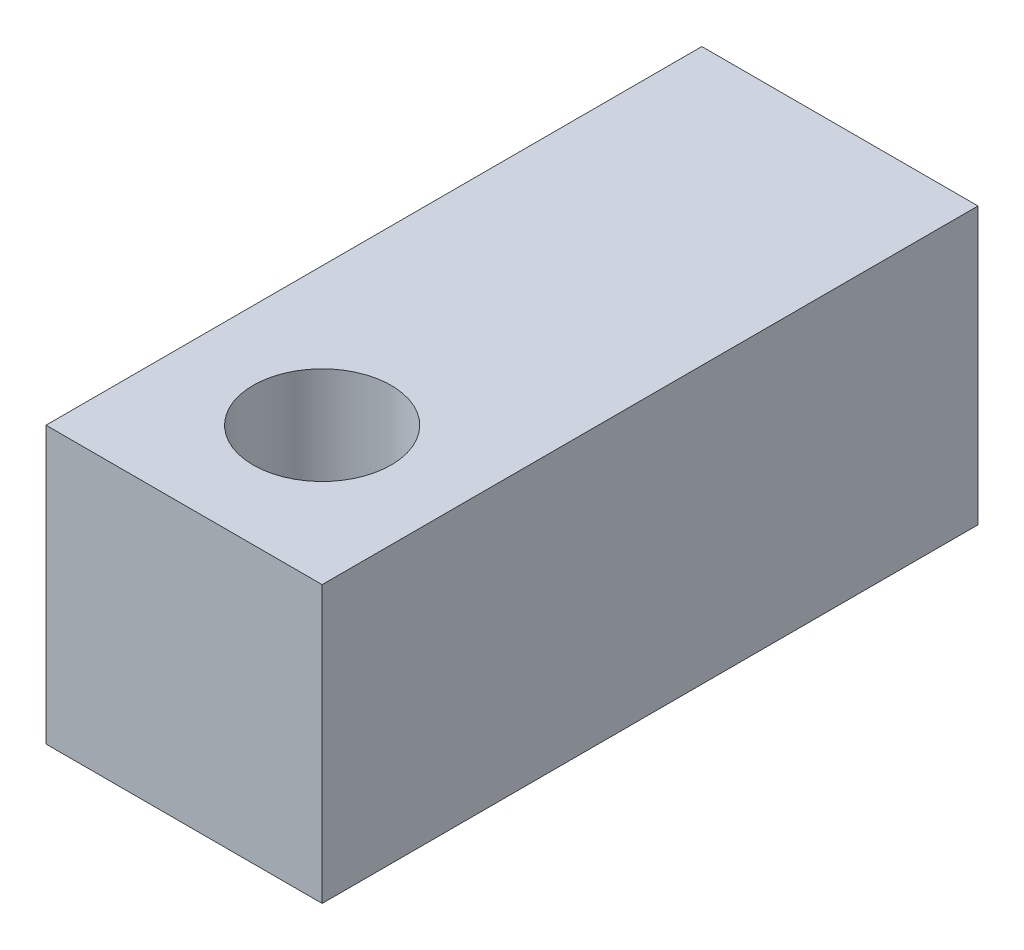
ISO-10303-21;
HEADER;
FILE_DESCRIPTION(('STEP AP214'),'2;1');
FILE_NAME('part.step','',(''),(''),'','','');
FILE_SCHEMA(('AUTOMOTIVE_DESIGN { 1 0 10303 214 1 1 1 1 }'));
ENDSEC;
DATA;
#1=APPLICATION_CONTEXT('core data for automotive mechanical design processes');
#2=APPLICATION_PROTOCOL_DEFINITION('international standard','automotive_design',2000,#1);
#3=PRODUCT_CONTEXT('',#1,'mechanical');
#4=PRODUCT('Part','Part','',(#3));
#5=PRODUCT_RELATED_PRODUCT_CATEGORY('part','',(#4));
#6=PRODUCT_DEFINITION_FORMATION('','',#4);
#7=PRODUCT_DEFINITION_CONTEXT('part definition',#1,'design');
#8=PRODUCT_DEFINITION('design','',#6,#7);
#9=PRODUCT_DEFINITION_SHAPE('','',#8);
#10=(LENGTH_UNIT() NAMED_UNIT(*) SI_UNIT(.MILLI.,.METRE.));
#11=(NAMED_UNIT(*) PLANE_ANGLE_UNIT() SI_UNIT($,.RADIAN.));
#12=(NAMED_UNIT(*) SI_UNIT($,.STERADIAN.) SOLID_ANGLE_UNIT());
#13=UNCERTAINTY_MEASURE_WITH_UNIT(LENGTH_MEASURE(1.E-05),#10,'distance_accuracy_value','');
#14=(GEOMETRIC_REPRESENTATION_CONTEXT(3) GLOBAL_UNCERTAINTY_ASSIGNED_CONTEXT((#13)) GLOBAL_UNIT_ASSIGNED_CONTEXT((#10,
#11,#12)) REPRESENTATION_CONTEXT('',''));
#15=CARTESIAN_POINT('',(0.,0.,0.));
#16=DIRECTION('',(0.,0.,1.));
#17=DIRECTION('',(1.,0.,0.));
#18=AXIS2_PLACEMENT_3D('',#15,#16,#17);
#19=CARTESIAN_POINT('',(-8.,-8.,38.));
#20=DIRECTION('',(1.,0.,0.));
#21=DIRECTION('',(0.,0.,-1.));
#22=AXIS2_PLACEMENT_3D('',#19,#20,#21);
#23=PLANE('',#22);
#24=DIRECTION('',(0.,-1.,0.));
#25=VECTOR('',#24,1.);
#26=CARTESIAN_POINT('',(-8.,-8.,0.));
#27=LINE('',#26,#25);
#28=CARTESIAN_POINT('',(-8.,8.,0.));
#29=VERTEX_POINT('',#28);
#30=CARTESIAN_POINT('',(-8.,-8.,0.));
#31=VERTEX_POINT('',#30);
#32=EDGE_CURVE('E105',#29,#31,#27,.T.);
#33=ORIENTED_EDGE('',*,*,#32,.T.);
#34=DIRECTION('',(0.,0.,-1.));
#35=VECTOR('',#34,1.);
#36=CARTESIAN_POINT('',(-8.,-8.,38.));
#37=LINE('',#36,#35);
#38=CARTESIAN_POINT('',(-8.,-8.,38.));
#39=VERTEX_POINT('',#38);
#40=EDGE_CURVE('E11',#39,#31,#37,.T.);
#41=ORIENTED_EDGE('',*,*,#40,.F.);
#42=DIRECTION('',(0.,-1.,0.));
#43=VECTOR('',#42,1.);
#44=CARTESIAN_POINT('',(-8.,-8.,38.));
#45=LINE('',#44,#43);
#46=CARTESIAN_POINT('',(-8.,8.,38.));
#47=VERTEX_POINT('',#46);
#48=EDGE_CURVE('E89',#47,#39,#45,.T.);
#49=ORIENTED_EDGE('',*,*,#48,.F.);
#50=DIRECTION('',(0.,0.,-1.));
#51=VECTOR('',#50,1.);
#52=CARTESIAN_POINT('',(-8.,8.,38.));
#53=LINE('',#52,#51);
#54=EDGE_CURVE('E98',#47,#29,#53,.T.);
#55=ORIENTED_EDGE('',*,*,#54,.T.);
#56=EDGE_LOOP('',(#33,#41,#49,#55));
#57=FACE_BOUND('',#56,.T.);
#58=ADVANCED_FACE('F39',(#57),#23,.F.);
#59=CARTESIAN_POINT('',(-8.,-8.,38.));
#60=DIRECTION('',(0.,1.,0.));
#61=DIRECTION('',(0.,0.,1.));
#62=AXIS2_PLACEMENT_3D('',#59,#60,#61);
#63=PLANE('',#62);
#64=CARTESIAN_POINT('',(0.,-8.,30.));
#65=DIRECTION('',(0.,1.,0.));
#66=DIRECTION('',(0.,0.,1.));
#67=AXIS2_PLACEMENT_3D('',#64,#65,#66);
#68=CIRCLE('',#67,4.);
#69=CARTESIAN_POINT('',(0.,-8.,34.));
#70=VERTEX_POINT('',#69);
#71=EDGE_CURVE('E104',#70,#70,#68,.T.);
#72=ORIENTED_EDGE('',*,*,#71,.T.);
#73=EDGE_LOOP('',(#72));
#74=FACE_BOUND('',#73,.T.);
#75=DIRECTION('',(1.,0.,0.));
#76=VECTOR('',#75,1.);
#77=CARTESIAN_POINT('',(-8.,-8.,0.));
#78=LINE('',#77,#76);
#79=CARTESIAN_POINT('',(8.,-8.,0.));
#80=VERTEX_POINT('',#79);
#81=EDGE_CURVE('E94',#31,#80,#78,.T.);
#82=ORIENTED_EDGE('',*,*,#81,.T.);
#83=DIRECTION('',(0.,0.,-1.));
#84=VECTOR('',#83,1.);
#85=CARTESIAN_POINT('',(8.,-8.,38.));
#86=LINE('',#85,#84);
#87=CARTESIAN_POINT('',(8.,-8.,38.));
#88=VERTEX_POINT('',#87);
#89=EDGE_CURVE('E50',#88,#80,#86,.T.);
#90=ORIENTED_EDGE('',*,*,#89,.F.);
#91=DIRECTION('',(1.,0.,0.));
#92=VECTOR('',#91,1.);
#93=CARTESIAN_POINT('',(-8.,-8.,38.));
#94=LINE('',#93,#92);
#95=EDGE_CURVE('E83',#39,#88,#94,.T.);
#96=ORIENTED_EDGE('',*,*,#95,.F.);
#97=ORIENTED_EDGE('',*,*,#40,.T.);
#98=EDGE_LOOP('',(#82,#90,#96,#97));
#99=FACE_BOUND('',#98,.T.);
#100=ADVANCED_FACE('F91',(#74,#99),#63,.F.);
#101=CARTESIAN_POINT('',(8.,-8.,38.));
#102=DIRECTION('',(-1.,0.,0.));
#103=DIRECTION('',(0.,0.,1.));
#104=AXIS2_PLACEMENT_3D('',#101,#102,#103);
#105=PLANE('',#104);
#106=DIRECTION('',(0.,1.,0.));
#107=VECTOR('',#106,1.);
#108=CARTESIAN_POINT('',(8.,-8.,0.));
#109=LINE('',#108,#107);
#110=CARTESIAN_POINT('',(8.,8.,0.));
#111=VERTEX_POINT('',#110);
#112=EDGE_CURVE('E75',#80,#111,#109,.T.);
#113=ORIENTED_EDGE('',*,*,#112,.T.);
#114=DIRECTION('',(0.,0.,-1.));
#115=VECTOR('',#114,1.);
#116=CARTESIAN_POINT('',(8.,8.,38.));
#117=LINE('',#116,#115);
#118=CARTESIAN_POINT('',(8.,8.,38.));
#119=VERTEX_POINT('',#118);
#120=EDGE_CURVE('E92',#119,#111,#117,.T.);
#121=ORIENTED_EDGE('',*,*,#120,.F.);
#122=DIRECTION('',(0.,1.,0.));
#123=VECTOR('',#122,1.);
#124=CARTESIAN_POINT('',(8.,-8.,38.));
#125=LINE('',#124,#123);
#126=EDGE_CURVE('E86',#88,#119,#125,.T.);
#127=ORIENTED_EDGE('',*,*,#126,.F.);
#128=ORIENTED_EDGE('',*,*,#89,.T.);
#129=EDGE_LOOP('',(#113,#121,#127,#128));
#130=FACE_BOUND('',#129,.T.);
#131=ADVANCED_FACE('F96',(#130),#105,.F.);
#132=CARTESIAN_POINT('',(-8.,8.,38.));
#133=DIRECTION('',(0.,-1.,0.));
#134=DIRECTION('',(0.,0.,-1.));
#135=AXIS2_PLACEMENT_3D('',#132,#133,#134);
#136=PLANE('',#135);
#137=CARTESIAN_POINT('',(0.,8.,30.));
#138=DIRECTION('',(0.,1.,0.));
#139=DIRECTION('',(0.,0.,1.));
#140=AXIS2_PLACEMENT_3D('',#137,#138,#139);
#141=CIRCLE('',#140,4.);
#142=CARTESIAN_POINT('',(0.,8.,34.));
#143=VERTEX_POINT('',#142);
#144=EDGE_CURVE('E119',#143,#143,#141,.T.);
#145=ORIENTED_EDGE('',*,*,#144,.F.);
#146=EDGE_LOOP('',(#145));
#147=FACE_BOUND('',#146,.T.);
#148=DIRECTION('',(-1.,0.,0.));
#149=VECTOR('',#148,1.);
#150=CARTESIAN_POINT('',(-8.,8.,0.));
#151=LINE('',#150,#149);
#152=EDGE_CURVE('E79',#111,#29,#151,.T.);
#153=ORIENTED_EDGE('',*,*,#152,.T.);
#154=ORIENTED_EDGE('',*,*,#54,.F.);
#155=DIRECTION('',(-1.,0.,0.));
#156=VECTOR('',#155,1.);
#157=CARTESIAN_POINT('',(-8.,8.,38.));
#158=LINE('',#157,#156);
#159=EDGE_CURVE('E54',#119,#47,#158,.T.);
#160=ORIENTED_EDGE('',*,*,#159,.F.);
#161=ORIENTED_EDGE('',*,*,#120,.T.);
#162=EDGE_LOOP('',(#153,#154,#160,#161));
#163=FACE_BOUND('',#162,.T.);
#164=ADVANCED_FACE('F109',(#147,#163),#136,.F.);
#165=CARTESIAN_POINT('',(0.,0.,38.));
#166=DIRECTION('',(0.,0.,-1.));
#167=DIRECTION('',(-1.,0.,0.));
#168=AXIS2_PLACEMENT_3D('',#165,#166,#167);
#169=PLANE('',#168);
#170=ORIENTED_EDGE('',*,*,#48,.T.);
#171=ORIENTED_EDGE('',*,*,#95,.T.);
#172=ORIENTED_EDGE('',*,*,#126,.T.);
#173=ORIENTED_EDGE('',*,*,#159,.T.);
#174=EDGE_LOOP('',(#170,#171,#172,#173));
#175=FACE_BOUND('',#174,.T.);
#176=ADVANCED_FACE('F88',(#175),#169,.F.);
#177=CARTESIAN_POINT('',(0.,0.,0.));
#178=DIRECTION('',(0.,0.,-1.));
#179=DIRECTION('',(-1.,0.,0.));
#180=AXIS2_PLACEMENT_3D('',#177,#178,#179);
#181=PLANE('',#180);
#182=CARTESIAN_POINT('',(0.,0.,0.));
#183=DIRECTION('',(0.,0.,-1.));
#184=DIRECTION('',(-1.,0.,0.));
#185=AXIS2_PLACEMENT_3D('',#182,#183,#184);
#186=CIRCLE('',#185,2.5);
#187=CARTESIAN_POINT('',(-2.5,0.,0.));
#188=VERTEX_POINT('',#187);
#189=EDGE_CURVE('E125',#188,#188,#186,.T.);
#190=ORIENTED_EDGE('',*,*,#189,.F.);
#191=EDGE_LOOP('',(#190));
#192=FACE_BOUND('',#191,.T.);
#193=ORIENTED_EDGE('',*,*,#32,.F.);
#194=ORIENTED_EDGE('',*,*,#152,.F.);
#195=ORIENTED_EDGE('',*,*,#112,.F.);
#196=ORIENTED_EDGE('',*,*,#81,.F.);
#197=EDGE_LOOP('',(#193,#194,#195,#196));
#198=FACE_BOUND('',#197,.T.);
#199=ADVANCED_FACE('F114',(#192,#198),#181,.T.);
#200=CARTESIAN_POINT('',(0.,-8.,30.));
#201=DIRECTION('',(0.,1.,0.));
#202=DIRECTION('',(0.,0.,1.));
#203=AXIS2_PLACEMENT_3D('',#200,#201,#202);
#204=CYLINDRICAL_SURFACE('',#203,4.);
#205=ORIENTED_EDGE('',*,*,#71,.F.);
#206=EDGE_LOOP('',(#205));
#207=FACE_BOUND('',#206,.T.);
#208=ORIENTED_EDGE('',*,*,#144,.T.);
#209=EDGE_LOOP('',(#208));
#210=FACE_BOUND('',#209,.T.);
#211=ADVANCED_FACE('F134',(#207,#210),#204,.F.);
#212=CARTESIAN_POINT('',(0.,0.,8.));
#213=DIRECTION('',(0.,0.,-1.));
#214=DIRECTION('',(-1.,0.,0.));
#215=AXIS2_PLACEMENT_3D('',#212,#213,#214);
#216=CYLINDRICAL_SURFACE('',#215,2.5);
#217=CARTESIAN_POINT('',(0.,0.,8.));
#218=DIRECTION('',(0.,0.,-1.));
#219=DIRECTION('',(-1.,0.,0.));
#220=AXIS2_PLACEMENT_3D('',#217,#218,#219);
#221=CIRCLE('',#220,2.5);
#222=CARTESIAN_POINT('',(-2.5,0.,8.));
#223=VERTEX_POINT('',#222);
#224=EDGE_CURVE('E122',#223,#223,#221,.T.);
#225=ORIENTED_EDGE('',*,*,#224,.F.);
#226=EDGE_LOOP('',(#225));
#227=FACE_BOUND('',#226,.T.);
#228=ORIENTED_EDGE('',*,*,#189,.T.);
#229=EDGE_LOOP('',(#228));
#230=FACE_BOUND('',#229,.T.);
#231=ADVANCED_FACE('F128',(#227,#230),#216,.F.);
#232=CARTESIAN_POINT('',(0.,0.,8.));
#233=DIRECTION('',(0.,0.,-1.));
#234=DIRECTION('',(-1.,0.,0.));
#235=AXIS2_PLACEMENT_3D('',#232,#233,#234);
#236=PLANE('',#235);
#237=ORIENTED_EDGE('',*,*,#224,.T.);
#238=EDGE_LOOP('',(#237));
#239=FACE_BOUND('',#238,.T.);
#240=ADVANCED_FACE('F126',(#239),#236,.T.);
#241=CLOSED_SHELL('',(#58,#100,#131,#164,#176,#199,#211,#231,#240));
#242=MANIFOLD_SOLID_BREP('B2',#241);
#243=ADVANCED_BREP_SHAPE_REPRESENTATION('',(#18,#242),#14);
#244=SHAPE_DEFINITION_REPRESENTATION(#9,#243);
ENDSEC;
END-ISO-10303-21;
